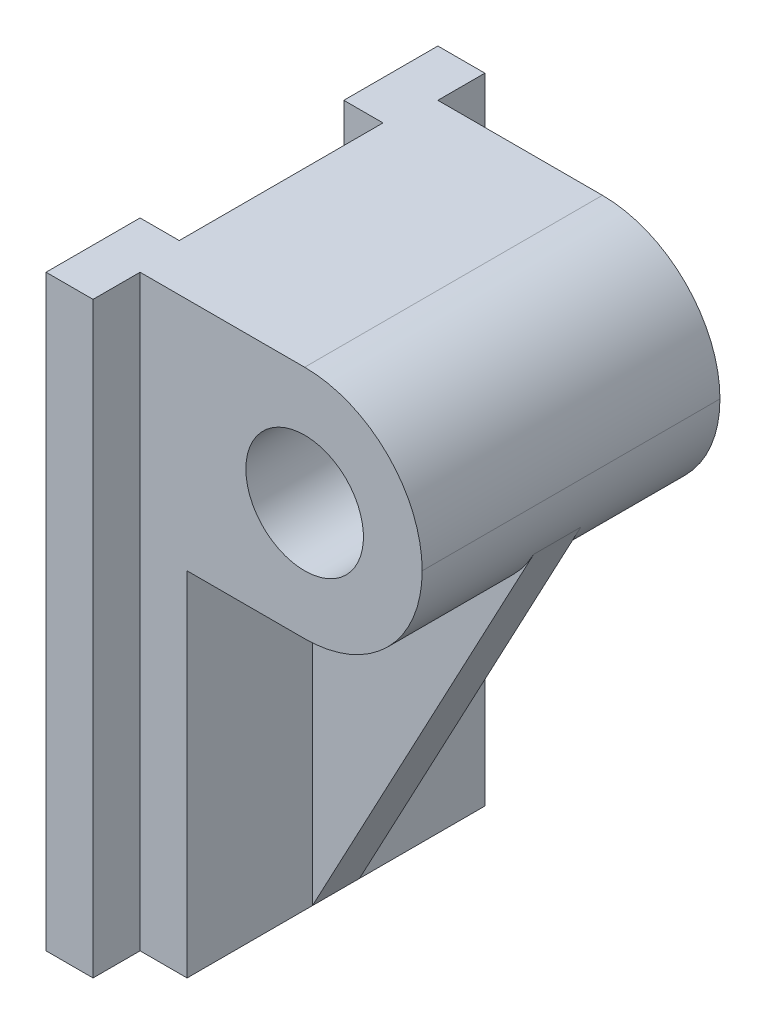
ISO-10303-21;
HEADER;
FILE_DESCRIPTION(('STEP AP214'),'2;1');
FILE_NAME('part.step','',(''),(''),'','','');
FILE_SCHEMA(('AUTOMOTIVE_DESIGN { 1 0 10303 214 1 1 1 1 }'));
ENDSEC;
DATA;
#1=APPLICATION_CONTEXT('core data for automotive mechanical design processes');
#2=APPLICATION_PROTOCOL_DEFINITION('international standard','automotive_design',2000,#1);
#3=PRODUCT_CONTEXT('',#1,'mechanical');
#4=PRODUCT('Part','Part','',(#3));
#5=PRODUCT_RELATED_PRODUCT_CATEGORY('part','',(#4));
#6=PRODUCT_DEFINITION_FORMATION('','',#4);
#7=PRODUCT_DEFINITION_CONTEXT('part definition',#1,'design');
#8=PRODUCT_DEFINITION('design','',#6,#7);
#9=PRODUCT_DEFINITION_SHAPE('','',#8);
#10=(LENGTH_UNIT() NAMED_UNIT(*) SI_UNIT(.MILLI.,.METRE.));
#11=(NAMED_UNIT(*) PLANE_ANGLE_UNIT() SI_UNIT($,.RADIAN.));
#12=(NAMED_UNIT(*) SI_UNIT($,.STERADIAN.) SOLID_ANGLE_UNIT());
#13=UNCERTAINTY_MEASURE_WITH_UNIT(LENGTH_MEASURE(1.E-05),#10,'distance_accuracy_value','');
#14=(GEOMETRIC_REPRESENTATION_CONTEXT(3) GLOBAL_UNCERTAINTY_ASSIGNED_CONTEXT((#13)) GLOBAL_UNIT_ASSIGNED_CONTEXT((#10,
#11,#12)) REPRESENTATION_CONTEXT('',''));
#15=CARTESIAN_POINT('',(0.,0.,0.));
#16=DIRECTION('',(0.,0.,1.));
#17=DIRECTION('',(1.,0.,0.));
#18=AXIS2_PLACEMENT_3D('',#15,#16,#17);
#19=CARTESIAN_POINT('',(24.,150.,38.));
#20=DIRECTION('',(-1.,0.,0.));
#21=DIRECTION('',(0.,0.,1.));
#22=AXIS2_PLACEMENT_3D('',#19,#20,#21);
#23=PLANE('',#22);
#24=DIRECTION('',(0.,1.,0.));
#25=VECTOR('',#24,1.);
#26=CARTESIAN_POINT('',(24.,150.,-6.));
#27=LINE('',#26,#25);
#28=CARTESIAN_POINT('',(24.,0.,-6.));
#29=VERTEX_POINT('',#28);
#30=CARTESIAN_POINT('',(23.9999999999999,90.,-6.));
#31=VERTEX_POINT('',#30);
#32=EDGE_CURVE('E181',#29,#31,#27,.T.);
#33=ORIENTED_EDGE('',*,*,#32,.F.);
#34=DIRECTION('',(0.,0.,-1.));
#35=VECTOR('',#34,1.);
#36=CARTESIAN_POINT('',(24.,0.,38.));
#37=LINE('',#36,#35);
#38=CARTESIAN_POINT('',(24.,0.,-38.));
#39=VERTEX_POINT('',#38);
#40=EDGE_CURVE('E187',#29,#39,#37,.T.);
#41=ORIENTED_EDGE('',*,*,#40,.T.);
#42=DIRECTION('',(0.,-1.,0.));
#43=VECTOR('',#42,1.);
#44=CARTESIAN_POINT('',(24.,150.,-38.));
#45=LINE('',#44,#43);
#46=CARTESIAN_POINT('',(24.,90.,-38.));
#47=VERTEX_POINT('',#46);
#48=EDGE_CURVE('E216',#47,#39,#45,.T.);
#49=ORIENTED_EDGE('',*,*,#48,.F.);
#50=DIRECTION('',(0.,0.,-1.));
#51=VECTOR('',#50,1.);
#52=CARTESIAN_POINT('',(23.9999999999999,90.,38.));
#53=LINE('',#52,#51);
#54=EDGE_CURVE('E189',#31,#47,#53,.T.);
#55=ORIENTED_EDGE('',*,*,#54,.F.);
#56=EDGE_LOOP('',(#33,#41,#49,#55));
#57=FACE_BOUND('',#56,.T.);
#58=ADVANCED_FACE('F33',(#57),#23,.F.);
#59=CARTESIAN_POINT('',(23.9999999999999,90.,38.));
#60=DIRECTION('',(0.,-1.,0.));
#61=DIRECTION('',(1.,0.,0.));
#62=AXIS2_PLACEMENT_3D('',#59,#60,#61);
#63=PLANE('',#62);
#64=DIRECTION('',(0.,0.,-1.));
#65=VECTOR('',#64,1.);
#66=CARTESIAN_POINT('',(53.9999999999999,90.,38.));
#67=LINE('',#66,#65);
#68=CARTESIAN_POINT('',(54.,90.,-38.));
#69=VERTEX_POINT('',#68);
#70=CARTESIAN_POINT('',(53.9999999999999,90.,-6.));
#71=VERTEX_POINT('',#70);
#72=EDGE_CURVE('E41',#69,#71,#67,.F.);
#73=ORIENTED_EDGE('',*,*,#72,.T.);
#74=DIRECTION('',(-1.,0.,0.));
#75=VECTOR('',#74,1.);
#76=CARTESIAN_POINT('',(23.9999999999999,90.,-6.));
#77=LINE('',#76,#75);
#78=EDGE_CURVE('E48',#71,#31,#77,.T.);
#79=ORIENTED_EDGE('',*,*,#78,.T.);
#80=ORIENTED_EDGE('',*,*,#54,.T.);
#81=DIRECTION('',(-1.,0.,0.));
#82=VECTOR('',#81,1.);
#83=CARTESIAN_POINT('',(24.,90.,-38.));
#84=LINE('',#83,#82);
#85=EDGE_CURVE('E266',#69,#47,#84,.T.);
#86=ORIENTED_EDGE('',*,*,#85,.F.);
#87=EDGE_LOOP('',(#73,#79,#80,#86));
#88=FACE_BOUND('',#87,.T.);
#89=ADVANCED_FACE('F379',(#88),#63,.T.);
#90=CARTESIAN_POINT('',(24.,0.,38.));
#91=VERTEX_POINT('',#90);
#92=CARTESIAN_POINT('',(24.,0.,6.));
#93=VERTEX_POINT('',#92);
#94=EDGE_CURVE('E197',#91,#93,#37,.T.);
#95=ORIENTED_EDGE('',*,*,#94,.T.);
#96=DIRECTION('',(0.,1.,0.));
#97=VECTOR('',#96,1.);
#98=CARTESIAN_POINT('',(24.,150.,6.));
#99=LINE('',#98,#97);
#100=CARTESIAN_POINT('',(23.9999999999999,90.,6.));
#101=VERTEX_POINT('',#100);
#102=EDGE_CURVE('E177',#93,#101,#99,.T.);
#103=ORIENTED_EDGE('',*,*,#102,.T.);
#104=CARTESIAN_POINT('',(24.,90.,38.));
#105=VERTEX_POINT('',#104);
#106=EDGE_CURVE('E273',#105,#101,#53,.T.);
#107=ORIENTED_EDGE('',*,*,#106,.F.);
#108=DIRECTION('',(0.,-1.,0.));
#109=VECTOR('',#108,1.);
#110=CARTESIAN_POINT('',(24.,150.,38.));
#111=LINE('',#110,#109);
#112=EDGE_CURVE('E218',#105,#91,#111,.T.);
#113=ORIENTED_EDGE('',*,*,#112,.T.);
#114=EDGE_LOOP('',(#95,#103,#107,#113));
#115=FACE_BOUND('',#114,.T.);
#116=ADVANCED_FACE('F326',(#115),#23,.F.);
#117=CARTESIAN_POINT('',(12.,150.,-50.));
#118=DIRECTION('',(0.,0.,1.));
#119=DIRECTION('',(1.,0.,0.));
#120=AXIS2_PLACEMENT_3D('',#117,#118,#119);
#121=PLANE('',#120);
#122=DIRECTION('',(-1.,0.,0.));
#123=VECTOR('',#122,1.);
#124=CARTESIAN_POINT('',(12.,0.,-50.));
#125=LINE('',#124,#123);
#126=CARTESIAN_POINT('',(12.,0.,-50.));
#127=VERTEX_POINT('',#126);
#128=CARTESIAN_POINT('',(0.,0.,-50.));
#129=VERTEX_POINT('',#128);
#130=EDGE_CURVE('E276',#127,#129,#125,.T.);
#131=ORIENTED_EDGE('',*,*,#130,.T.);
#132=DIRECTION('',(0.,-1.,0.));
#133=VECTOR('',#132,1.);
#134=CARTESIAN_POINT('',(0.,150.,-50.));
#135=LINE('',#134,#133);
#136=CARTESIAN_POINT('',(0.,150.,-50.));
#137=VERTEX_POINT('',#136);
#138=EDGE_CURVE('E241',#137,#129,#135,.T.);
#139=ORIENTED_EDGE('',*,*,#138,.F.);
#140=DIRECTION('',(-1.,0.,0.));
#141=VECTOR('',#140,1.);
#142=CARTESIAN_POINT('',(12.,150.,-50.));
#143=LINE('',#142,#141);
#144=CARTESIAN_POINT('',(12.,150.,-50.));
#145=VERTEX_POINT('',#144);
#146=EDGE_CURVE('E208',#145,#137,#143,.T.);
#147=ORIENTED_EDGE('',*,*,#146,.F.);
#148=DIRECTION('',(0.,-1.,0.));
#149=VECTOR('',#148,1.);
#150=CARTESIAN_POINT('',(12.,150.,-50.));
#151=LINE('',#150,#149);
#152=EDGE_CURVE('E209',#145,#127,#151,.T.);
#153=ORIENTED_EDGE('',*,*,#152,.T.);
#154=EDGE_LOOP('',(#131,#139,#147,#153));
#155=FACE_BOUND('',#154,.T.);
#156=ADVANCED_FACE('F367',(#155),#121,.F.);
#157=CARTESIAN_POINT('',(0.,150.,-50.));
#158=DIRECTION('',(1.,0.,0.));
#159=DIRECTION('',(0.,0.,-1.));
#160=AXIS2_PLACEMENT_3D('',#157,#158,#159);
#161=PLANE('',#160);
#162=DIRECTION('',(0.,0.,1.));
#163=VECTOR('',#162,1.);
#164=CARTESIAN_POINT('',(0.,0.,-50.));
#165=LINE('',#164,#163);
#166=CARTESIAN_POINT('',(0.,0.,-26.));
#167=VERTEX_POINT('',#166);
#168=EDGE_CURVE('E301',#129,#167,#165,.T.);
#169=ORIENTED_EDGE('',*,*,#168,.T.);
#170=DIRECTION('',(0.,-1.,0.));
#171=VECTOR('',#170,1.);
#172=CARTESIAN_POINT('',(0.,150.,-26.));
#173=LINE('',#172,#171);
#174=CARTESIAN_POINT('',(0.,150.,-26.));
#175=VERTEX_POINT('',#174);
#176=EDGE_CURVE('E238',#175,#167,#173,.T.);
#177=ORIENTED_EDGE('',*,*,#176,.F.);
#178=DIRECTION('',(0.,0.,1.));
#179=VECTOR('',#178,1.);
#180=CARTESIAN_POINT('',(0.,150.,-50.));
#181=LINE('',#180,#179);
#182=EDGE_CURVE('E279',#137,#175,#181,.T.);
#183=ORIENTED_EDGE('',*,*,#182,.F.);
#184=ORIENTED_EDGE('',*,*,#138,.T.);
#185=EDGE_LOOP('',(#169,#177,#183,#184));
#186=FACE_BOUND('',#185,.T.);
#187=ADVANCED_FACE('F363',(#186),#161,.F.);
#188=CARTESIAN_POINT('',(0.,150.,-26.));
#189=DIRECTION('',(0.,0.,-1.));
#190=DIRECTION('',(-1.,0.,0.));
#191=AXIS2_PLACEMENT_3D('',#188,#189,#190);
#192=PLANE('',#191);
#193=DIRECTION('',(1.,0.,0.));
#194=VECTOR('',#193,1.);
#195=CARTESIAN_POINT('',(0.,0.,-26.));
#196=LINE('',#195,#194);
#197=CARTESIAN_POINT('',(9.99999999999999,0.,-26.));
#198=VERTEX_POINT('',#197);
#199=EDGE_CURVE('E303',#167,#198,#196,.T.);
#200=ORIENTED_EDGE('',*,*,#199,.T.);
#201=DIRECTION('',(0.,-1.,0.));
#202=VECTOR('',#201,1.);
#203=CARTESIAN_POINT('',(9.99999999999999,150.,-26.));
#204=LINE('',#203,#202);
#205=CARTESIAN_POINT('',(9.99999999999999,150.,-26.));
#206=VERTEX_POINT('',#205);
#207=EDGE_CURVE('E235',#206,#198,#204,.T.);
#208=ORIENTED_EDGE('',*,*,#207,.F.);
#209=DIRECTION('',(1.,0.,0.));
#210=VECTOR('',#209,1.);
#211=CARTESIAN_POINT('',(0.,150.,-26.));
#212=LINE('',#211,#210);
#213=EDGE_CURVE('E281',#175,#206,#212,.T.);
#214=ORIENTED_EDGE('',*,*,#213,.F.);
#215=ORIENTED_EDGE('',*,*,#176,.T.);
#216=EDGE_LOOP('',(#200,#208,#214,#215));
#217=FACE_BOUND('',#216,.T.);
#218=ADVANCED_FACE('F359',(#217),#192,.F.);
#219=CARTESIAN_POINT('',(9.99999999999999,150.,-26.));
#220=DIRECTION('',(1.,0.,0.));
#221=DIRECTION('',(0.,0.,-1.));
#222=AXIS2_PLACEMENT_3D('',#219,#220,#221);
#223=PLANE('',#222);
#224=DIRECTION('',(0.,-1.,0.));
#225=VECTOR('',#224,1.);
#226=CARTESIAN_POINT('',(9.99999999999999,150.,26.));
#227=LINE('',#226,#225);
#228=CARTESIAN_POINT('',(9.99999999999999,150.,26.));
#229=VERTEX_POINT('',#228);
#230=CARTESIAN_POINT('',(9.99999999999999,0.,26.));
#231=VERTEX_POINT('',#230);
#232=EDGE_CURVE('E232',#229,#231,#227,.T.);
#233=ORIENTED_EDGE('',*,*,#232,.F.);
#234=DIRECTION('',(0.,0.,1.));
#235=VECTOR('',#234,1.);
#236=CARTESIAN_POINT('',(9.99999999999999,150.,-26.));
#237=LINE('',#236,#235);
#238=EDGE_CURVE('E283',#206,#229,#237,.T.);
#239=ORIENTED_EDGE('',*,*,#238,.F.);
#240=ORIENTED_EDGE('',*,*,#207,.T.);
#241=DIRECTION('',(0.,0.,1.));
#242=VECTOR('',#241,1.);
#243=CARTESIAN_POINT('',(9.99999999999999,0.,-26.));
#244=LINE('',#243,#242);
#245=EDGE_CURVE('E305',#198,#231,#244,.T.);
#246=ORIENTED_EDGE('',*,*,#245,.T.);
#247=EDGE_LOOP('',(#233,#239,#240,#246));
#248=FACE_BOUND('',#247,.T.);
#249=ADVANCED_FACE('F354',(#248),#223,.F.);
#250=CARTESIAN_POINT('',(9.99999999999999,150.,26.));
#251=DIRECTION('',(0.,0.,1.));
#252=DIRECTION('',(1.,0.,0.));
#253=AXIS2_PLACEMENT_3D('',#250,#251,#252);
#254=PLANE('',#253);
#255=DIRECTION('',(-1.,0.,0.));
#256=VECTOR('',#255,1.);
#257=CARTESIAN_POINT('',(9.99999999999999,0.,26.));
#258=LINE('',#257,#256);
#259=CARTESIAN_POINT('',(0.,0.,26.));
#260=VERTEX_POINT('',#259);
#261=EDGE_CURVE('E307',#231,#260,#258,.T.);
#262=ORIENTED_EDGE('',*,*,#261,.T.);
#263=DIRECTION('',(0.,-1.,0.));
#264=VECTOR('',#263,1.);
#265=CARTESIAN_POINT('',(0.,150.,26.));
#266=LINE('',#265,#264);
#267=CARTESIAN_POINT('',(0.,150.,26.));
#268=VERTEX_POINT('',#267);
#269=EDGE_CURVE('E229',#268,#260,#266,.T.);
#270=ORIENTED_EDGE('',*,*,#269,.F.);
#271=DIRECTION('',(-1.,0.,0.));
#272=VECTOR('',#271,1.);
#273=CARTESIAN_POINT('',(9.99999999999999,150.,26.));
#274=LINE('',#273,#272);
#275=EDGE_CURVE('E285',#229,#268,#274,.T.);
#276=ORIENTED_EDGE('',*,*,#275,.F.);
#277=ORIENTED_EDGE('',*,*,#232,.T.);
#278=EDGE_LOOP('',(#262,#270,#276,#277));
#279=FACE_BOUND('',#278,.T.);
#280=ADVANCED_FACE('F350',(#279),#254,.F.);
#281=CARTESIAN_POINT('',(0.,150.,26.));
#282=DIRECTION('',(1.,0.,0.));
#283=DIRECTION('',(0.,0.,-1.));
#284=AXIS2_PLACEMENT_3D('',#281,#282,#283);
#285=PLANE('',#284);
#286=DIRECTION('',(0.,0.,1.));
#287=VECTOR('',#286,1.);
#288=CARTESIAN_POINT('',(0.,0.,26.));
#289=LINE('',#288,#287);
#290=CARTESIAN_POINT('',(0.,0.,50.));
#291=VERTEX_POINT('',#290);
#292=EDGE_CURVE('E309',#260,#291,#289,.T.);
#293=ORIENTED_EDGE('',*,*,#292,.T.);
#294=DIRECTION('',(0.,-1.,0.));
#295=VECTOR('',#294,1.);
#296=CARTESIAN_POINT('',(0.,150.,50.));
#297=LINE('',#296,#295);
#298=CARTESIAN_POINT('',(0.,150.,50.));
#299=VERTEX_POINT('',#298);
#300=EDGE_CURVE('E226',#299,#291,#297,.T.);
#301=ORIENTED_EDGE('',*,*,#300,.F.);
#302=DIRECTION('',(0.,0.,1.));
#303=VECTOR('',#302,1.);
#304=CARTESIAN_POINT('',(0.,150.,26.));
#305=LINE('',#304,#303);
#306=EDGE_CURVE('E287',#268,#299,#305,.T.);
#307=ORIENTED_EDGE('',*,*,#306,.F.);
#308=ORIENTED_EDGE('',*,*,#269,.T.);
#309=EDGE_LOOP('',(#293,#301,#307,#308));
#310=FACE_BOUND('',#309,.T.);
#311=ADVANCED_FACE('F346',(#310),#285,.F.);
#312=CARTESIAN_POINT('',(0.,150.,50.));
#313=DIRECTION('',(0.,0.,-1.));
#314=DIRECTION('',(-1.,0.,0.));
#315=AXIS2_PLACEMENT_3D('',#312,#313,#314);
#316=PLANE('',#315);
#317=DIRECTION('',(1.,0.,0.));
#318=VECTOR('',#317,1.);
#319=CARTESIAN_POINT('',(0.,0.,50.));
#320=LINE('',#319,#318);
#321=CARTESIAN_POINT('',(12.,0.,50.));
#322=VERTEX_POINT('',#321);
#323=EDGE_CURVE('E311',#291,#322,#320,.T.);
#324=ORIENTED_EDGE('',*,*,#323,.T.);
#325=DIRECTION('',(0.,-1.,0.));
#326=VECTOR('',#325,1.);
#327=CARTESIAN_POINT('',(12.,150.,50.));
#328=LINE('',#327,#326);
#329=CARTESIAN_POINT('',(12.,150.,50.));
#330=VERTEX_POINT('',#329);
#331=EDGE_CURVE('E223',#330,#322,#328,.T.);
#332=ORIENTED_EDGE('',*,*,#331,.F.);
#333=DIRECTION('',(1.,0.,0.));
#334=VECTOR('',#333,1.);
#335=CARTESIAN_POINT('',(0.,150.,50.));
#336=LINE('',#335,#334);
#337=EDGE_CURVE('E289',#299,#330,#336,.T.);
#338=ORIENTED_EDGE('',*,*,#337,.F.);
#339=ORIENTED_EDGE('',*,*,#300,.T.);
#340=EDGE_LOOP('',(#324,#332,#338,#339));
#341=FACE_BOUND('',#340,.T.);
#342=ADVANCED_FACE('F342',(#341),#316,.F.);
#343=CARTESIAN_POINT('',(12.,150.,50.));
#344=DIRECTION('',(-1.,0.,0.));
#345=DIRECTION('',(0.,0.,1.));
#346=AXIS2_PLACEMENT_3D('',#343,#344,#345);
#347=PLANE('',#346);
#348=DIRECTION('',(0.,0.,-1.));
#349=VECTOR('',#348,1.);
#350=CARTESIAN_POINT('',(12.,0.,50.));
#351=LINE('',#350,#349);
#352=CARTESIAN_POINT('',(12.,0.,38.));
#353=VERTEX_POINT('',#352);
#354=EDGE_CURVE('E201',#322,#353,#351,.T.);
#355=ORIENTED_EDGE('',*,*,#354,.T.);
#356=DIRECTION('',(0.,-1.,0.));
#357=VECTOR('',#356,1.);
#358=CARTESIAN_POINT('',(12.,150.,38.));
#359=LINE('',#358,#357);
#360=CARTESIAN_POINT('',(12.,150.,38.));
#361=VERTEX_POINT('',#360);
#362=EDGE_CURVE('E220',#361,#353,#359,.T.);
#363=ORIENTED_EDGE('',*,*,#362,.F.);
#364=DIRECTION('',(0.,0.,-1.));
#365=VECTOR('',#364,1.);
#366=CARTESIAN_POINT('',(12.,150.,50.));
#367=LINE('',#366,#365);
#368=EDGE_CURVE('E291',#330,#361,#367,.T.);
#369=ORIENTED_EDGE('',*,*,#368,.F.);
#370=ORIENTED_EDGE('',*,*,#331,.T.);
#371=EDGE_LOOP('',(#355,#363,#369,#370));
#372=FACE_BOUND('',#371,.T.);
#373=ADVANCED_FACE('F315',(#372),#347,.F.);
#374=CARTESIAN_POINT('',(12.,150.,38.));
#375=DIRECTION('',(0.,0.,-1.));
#376=DIRECTION('',(-1.,0.,0.));
#377=AXIS2_PLACEMENT_3D('',#374,#375,#376);
#378=PLANE('',#377);
#379=CARTESIAN_POINT('',(53.9999999999999,120.,38.));
#380=DIRECTION('',(0.,0.,-1.));
#381=DIRECTION('',(-1.,0.,0.));
#382=AXIS2_PLACEMENT_3D('',#379,#380,#381);
#383=CIRCLE('',#382,30.);
#384=CARTESIAN_POINT('',(53.9999999999999,90.,38.));
#385=VERTEX_POINT('',#384);
#386=CARTESIAN_POINT('',(83.9999999999999,120.,38.));
#387=VERTEX_POINT('',#386);
#388=EDGE_CURVE('E56',#385,#387,#383,.F.);
#389=ORIENTED_EDGE('',*,*,#388,.T.);
#390=CARTESIAN_POINT('',(53.9999999999999,120.,38.));
#391=DIRECTION('',(0.,0.,-1.));
#392=DIRECTION('',(-1.,0.,0.));
#393=AXIS2_PLACEMENT_3D('',#390,#391,#392);
#394=CIRCLE('',#393,30.);
#395=CARTESIAN_POINT('',(53.9999999999999,150.,38.));
#396=VERTEX_POINT('',#395);
#397=EDGE_CURVE('E252',#387,#396,#394,.F.);
#398=ORIENTED_EDGE('',*,*,#397,.T.);
#399=DIRECTION('',(1.,0.,0.));
#400=VECTOR('',#399,1.);
#401=CARTESIAN_POINT('',(12.,150.,38.));
#402=LINE('',#401,#400);
#403=EDGE_CURVE('E293',#361,#396,#402,.T.);
#404=ORIENTED_EDGE('',*,*,#403,.F.);
#405=ORIENTED_EDGE('',*,*,#362,.T.);
#406=DIRECTION('',(1.,0.,0.));
#407=VECTOR('',#406,1.);
#408=CARTESIAN_POINT('',(12.,0.,38.));
#409=LINE('',#408,#407);
#410=EDGE_CURVE('E198',#353,#91,#409,.T.);
#411=ORIENTED_EDGE('',*,*,#410,.T.);
#412=ORIENTED_EDGE('',*,*,#112,.F.);
#413=DIRECTION('',(-1.,0.,0.));
#414=VECTOR('',#413,1.);
#415=CARTESIAN_POINT('',(23.9999999999999,90.,38.));
#416=LINE('',#415,#414);
#417=EDGE_CURVE('E269',#385,#105,#416,.T.);
#418=ORIENTED_EDGE('',*,*,#417,.F.);
#419=EDGE_LOOP('',(#389,#398,#404,#405,#411,#412,#418));
#420=FACE_BOUND('',#419,.T.);
#421=CARTESIAN_POINT('',(53.9999999999999,120.,38.));
#422=DIRECTION('',(0.,0.,-1.));
#423=DIRECTION('',(-1.,0.,0.));
#424=AXIS2_PLACEMENT_3D('',#421,#422,#423);
#425=CIRCLE('',#424,15.);
#426=CARTESIAN_POINT('',(38.9999999999999,120.,38.));
#427=VERTEX_POINT('',#426);
#428=EDGE_CURVE('E261',#427,#427,#425,.T.);
#429=ORIENTED_EDGE('',*,*,#428,.T.);
#430=EDGE_LOOP('',(#429));
#431=FACE_BOUND('',#430,.T.);
#432=ADVANCED_FACE('F321',(#420,#431),#378,.F.);
#433=CARTESIAN_POINT('',(24.,150.,-38.));
#434=DIRECTION('',(0.,0.,1.));
#435=DIRECTION('',(1.,0.,0.));
#436=AXIS2_PLACEMENT_3D('',#433,#434,#435);
#437=PLANE('',#436);
#438=DIRECTION('',(-1.,0.,0.));
#439=VECTOR('',#438,1.);
#440=CARTESIAN_POINT('',(24.,150.,-38.));
#441=LINE('',#440,#439);
#442=CARTESIAN_POINT('',(54.,150.,-38.));
#443=VERTEX_POINT('',#442);
#444=CARTESIAN_POINT('',(12.,150.,-38.));
#445=VERTEX_POINT('',#444);
#446=EDGE_CURVE('E296',#443,#445,#441,.T.);
#447=ORIENTED_EDGE('',*,*,#446,.F.);
#448=CARTESIAN_POINT('',(54.,120.,-38.));
#449=DIRECTION('',(0.,0.,1.));
#450=DIRECTION('',(1.,0.,0.));
#451=AXIS2_PLACEMENT_3D('',#448,#449,#450);
#452=CIRCLE('',#451,30.);
#453=CARTESIAN_POINT('',(83.9999999999999,120.,-38.));
#454=VERTEX_POINT('',#453);
#455=EDGE_CURVE('E248',#443,#454,#452,.F.);
#456=ORIENTED_EDGE('',*,*,#455,.T.);
#457=CARTESIAN_POINT('',(54.,120.,-38.));
#458=DIRECTION('',(0.,0.,1.));
#459=DIRECTION('',(1.,0.,0.));
#460=AXIS2_PLACEMENT_3D('',#457,#458,#459);
#461=CIRCLE('',#460,30.);
#462=EDGE_CURVE('E246',#454,#69,#461,.F.);
#463=ORIENTED_EDGE('',*,*,#462,.T.);
#464=ORIENTED_EDGE('',*,*,#85,.T.);
#465=ORIENTED_EDGE('',*,*,#48,.T.);
#466=DIRECTION('',(-1.,0.,0.));
#467=VECTOR('',#466,1.);
#468=CARTESIAN_POINT('',(24.,0.,-38.));
#469=LINE('',#468,#467);
#470=CARTESIAN_POINT('',(12.,0.,-38.));
#471=VERTEX_POINT('',#470);
#472=EDGE_CURVE('E196',#39,#471,#469,.T.);
#473=ORIENTED_EDGE('',*,*,#472,.T.);
#474=DIRECTION('',(0.,-1.,0.));
#475=VECTOR('',#474,1.);
#476=CARTESIAN_POINT('',(12.,150.,-38.));
#477=LINE('',#476,#475);
#478=EDGE_CURVE('E212',#445,#471,#477,.T.);
#479=ORIENTED_EDGE('',*,*,#478,.F.);
#480=EDGE_LOOP('',(#447,#456,#463,#464,#465,#473,#479));
#481=FACE_BOUND('',#480,.T.);
#482=CARTESIAN_POINT('',(54.,120.,-38.));
#483=DIRECTION('',(0.,0.,-1.));
#484=DIRECTION('',(-1.,0.,0.));
#485=AXIS2_PLACEMENT_3D('',#482,#483,#484);
#486=CIRCLE('',#485,15.);
#487=CARTESIAN_POINT('',(39.,120.,-38.));
#488=VERTEX_POINT('',#487);
#489=EDGE_CURVE('E256',#488,#488,#486,.T.);
#490=ORIENTED_EDGE('',*,*,#489,.F.);
#491=EDGE_LOOP('',(#490));
#492=FACE_BOUND('',#491,.T.);
#493=ADVANCED_FACE('F375',(#481,#492),#437,.F.);
#494=CARTESIAN_POINT('',(12.,150.,-38.));
#495=DIRECTION('',(-1.,0.,0.));
#496=DIRECTION('',(0.,0.,1.));
#497=AXIS2_PLACEMENT_3D('',#494,#495,#496);
#498=PLANE('',#497);
#499=DIRECTION('',(0.,0.,-1.));
#500=VECTOR('',#499,1.);
#501=CARTESIAN_POINT('',(12.,0.,-38.));
#502=LINE('',#501,#500);
#503=EDGE_CURVE('E206',#471,#127,#502,.T.);
#504=ORIENTED_EDGE('',*,*,#503,.T.);
#505=ORIENTED_EDGE('',*,*,#152,.F.);
#506=DIRECTION('',(0.,0.,-1.));
#507=VECTOR('',#506,1.);
#508=CARTESIAN_POINT('',(12.,150.,-38.));
#509=LINE('',#508,#507);
#510=EDGE_CURVE('E213',#445,#145,#509,.T.);
#511=ORIENTED_EDGE('',*,*,#510,.F.);
#512=ORIENTED_EDGE('',*,*,#478,.T.);
#513=EDGE_LOOP('',(#504,#505,#511,#512));
#514=FACE_BOUND('',#513,.T.);
#515=ADVANCED_FACE('F370',(#514),#498,.F.);
#516=CARTESIAN_POINT('',(0.,150.,0.));
#517=DIRECTION('',(0.,1.,0.));
#518=DIRECTION('',(0.,0.,1.));
#519=AXIS2_PLACEMENT_3D('',#516,#517,#518);
#520=PLANE('',#519);
#521=DIRECTION('',(0.,0.,-1.));
#522=VECTOR('',#521,1.);
#523=CARTESIAN_POINT('',(53.9999999999999,150.,0.));
#524=LINE('',#523,#522);
#525=EDGE_CURVE('E244',#396,#443,#524,.T.);
#526=ORIENTED_EDGE('',*,*,#525,.T.);
#527=ORIENTED_EDGE('',*,*,#446,.T.);
#528=ORIENTED_EDGE('',*,*,#510,.T.);
#529=ORIENTED_EDGE('',*,*,#146,.T.);
#530=ORIENTED_EDGE('',*,*,#182,.T.);
#531=ORIENTED_EDGE('',*,*,#213,.T.);
#532=ORIENTED_EDGE('',*,*,#238,.T.);
#533=ORIENTED_EDGE('',*,*,#275,.T.);
#534=ORIENTED_EDGE('',*,*,#306,.T.);
#535=ORIENTED_EDGE('',*,*,#337,.T.);
#536=ORIENTED_EDGE('',*,*,#368,.T.);
#537=ORIENTED_EDGE('',*,*,#403,.T.);
#538=EDGE_LOOP('',(#526,#527,#528,#529,#530,#531,#532,#533,#534,#535,#536,#537));
#539=FACE_BOUND('',#538,.T.);
#540=ADVANCED_FACE('F337',(#539),#520,.T.);
#541=CARTESIAN_POINT('',(0.,0.,0.));
#542=DIRECTION('',(0.,1.,0.));
#543=DIRECTION('',(0.,0.,1.));
#544=AXIS2_PLACEMENT_3D('',#541,#542,#543);
#545=PLANE('',#544);
#546=ORIENTED_EDGE('',*,*,#261,.F.);
#547=ORIENTED_EDGE('',*,*,#245,.F.);
#548=ORIENTED_EDGE('',*,*,#199,.F.);
#549=ORIENTED_EDGE('',*,*,#168,.F.);
#550=ORIENTED_EDGE('',*,*,#130,.F.);
#551=ORIENTED_EDGE('',*,*,#503,.F.);
#552=ORIENTED_EDGE('',*,*,#472,.F.);
#553=ORIENTED_EDGE('',*,*,#40,.F.);
#554=DIRECTION('',(0.,0.,-1.));
#555=VECTOR('',#554,1.);
#556=CARTESIAN_POINT('',(24.,0.,0.));
#557=LINE('',#556,#555);
#558=EDGE_CURVE('E165',#93,#29,#557,.T.);
#559=ORIENTED_EDGE('',*,*,#558,.F.);
#560=ORIENTED_EDGE('',*,*,#94,.F.);
#561=ORIENTED_EDGE('',*,*,#410,.F.);
#562=ORIENTED_EDGE('',*,*,#354,.F.);
#563=ORIENTED_EDGE('',*,*,#323,.F.);
#564=ORIENTED_EDGE('',*,*,#292,.F.);
#565=EDGE_LOOP('',(#546,#547,#548,#549,#550,#551,#552,#553,#559,#560,#561,#562,#563,#564));
#566=FACE_BOUND('',#565,.T.);
#567=ADVANCED_FACE('F194',(#566),#545,.F.);
#568=DIRECTION('',(-1.,0.,0.));
#569=VECTOR('',#568,1.);
#570=CARTESIAN_POINT('',(23.9999999999999,90.,6.));
#571=LINE('',#570,#569);
#572=CARTESIAN_POINT('',(53.9999999999999,90.,6.));
#573=VERTEX_POINT('',#572);
#574=EDGE_CURVE('E385',#573,#101,#571,.T.);
#575=ORIENTED_EDGE('',*,*,#574,.F.);
#576=EDGE_CURVE('E254',#573,#385,#67,.F.);
#577=ORIENTED_EDGE('',*,*,#576,.T.);
#578=ORIENTED_EDGE('',*,*,#417,.T.);
#579=ORIENTED_EDGE('',*,*,#106,.T.);
#580=EDGE_LOOP('',(#575,#577,#578,#579));
#581=FACE_BOUND('',#580,.T.);
#582=ADVANCED_FACE('F390',(#581),#63,.T.);
#583=CARTESIAN_POINT('',(53.9999999999999,120.,38.));
#584=DIRECTION('',(0.,0.,-1.));
#585=DIRECTION('',(-1.,0.,0.));
#586=AXIS2_PLACEMENT_3D('',#583,#584,#585);
#587=CYLINDRICAL_SURFACE('',#586,15.);
#588=ORIENTED_EDGE('',*,*,#428,.F.);
#589=EDGE_LOOP('',(#588));
#590=FACE_BOUND('',#589,.T.);
#591=ORIENTED_EDGE('',*,*,#489,.T.);
#592=EDGE_LOOP('',(#591));
#593=FACE_BOUND('',#592,.T.);
#594=ADVANCED_FACE('F392',(#590,#593),#587,.F.);
#595=CARTESIAN_POINT('',(53.9999999999999,120.,38.));
#596=DIRECTION('',(0.,0.,-1.));
#597=DIRECTION('',(-1.,0.,0.));
#598=AXIS2_PLACEMENT_3D('',#595,#596,#597);
#599=CYLINDRICAL_SURFACE('',#598,30.);
#600=CARTESIAN_POINT('',(53.9999999999999,120.,6.));
#601=DIRECTION('',(0.,0.,1.));
#602=DIRECTION('',(1.,0.,0.));
#603=AXIS2_PLACEMENT_3D('',#600,#601,#602);
#604=CIRCLE('',#603,30.);
#605=CARTESIAN_POINT('',(80.470588235294,105.882352941176,6.));
#606=VERTEX_POINT('',#605);
#607=EDGE_CURVE('E190',#606,#573,#604,.F.);
#608=ORIENTED_EDGE('',*,*,#607,.F.);
#609=DIRECTION('',(0.,0.,-1.));
#610=VECTOR('',#609,1.);
#611=CARTESIAN_POINT('',(80.470588235294,105.882352941176,38.));
#612=LINE('',#611,#610);
#613=CARTESIAN_POINT('',(80.470588235294,105.882352941176,-6.));
#614=VERTEX_POINT('',#613);
#615=EDGE_CURVE('E11',#614,#606,#612,.F.);
#616=ORIENTED_EDGE('',*,*,#615,.F.);
#617=CARTESIAN_POINT('',(53.9999999999999,120.,-6.));
#618=DIRECTION('',(0.,0.,1.));
#619=DIRECTION('',(1.,0.,0.));
#620=AXIS2_PLACEMENT_3D('',#617,#618,#619);
#621=CIRCLE('',#620,30.);
#622=EDGE_CURVE('E182',#614,#71,#621,.F.);
#623=ORIENTED_EDGE('',*,*,#622,.T.);
#624=ORIENTED_EDGE('',*,*,#72,.F.);
#625=ORIENTED_EDGE('',*,*,#462,.F.);
#626=DIRECTION('',(0.,0.,-1.));
#627=VECTOR('',#626,1.);
#628=CARTESIAN_POINT('',(83.9999999999999,120.,38.));
#629=LINE('',#628,#627);
#630=EDGE_CURVE('E176',#387,#454,#629,.T.);
#631=ORIENTED_EDGE('',*,*,#630,.F.);
#632=ORIENTED_EDGE('',*,*,#388,.F.);
#633=ORIENTED_EDGE('',*,*,#576,.F.);
#634=EDGE_LOOP('',(#608,#616,#623,#624,#625,#631,#632,#633));
#635=FACE_BOUND('',#634,.T.);
#636=ADVANCED_FACE('F35',(#635),#599,.T.);
#637=CARTESIAN_POINT('',(53.9999999999999,120.,0.));
#638=DIRECTION('',(0.,0.,-1.));
#639=DIRECTION('',(-1.,0.,0.));
#640=AXIS2_PLACEMENT_3D('',#637,#638,#639);
#641=CYLINDRICAL_SURFACE('',#640,30.);
#642=ORIENTED_EDGE('',*,*,#630,.T.);
#643=ORIENTED_EDGE('',*,*,#455,.F.);
#644=ORIENTED_EDGE('',*,*,#525,.F.);
#645=ORIENTED_EDGE('',*,*,#397,.F.);
#646=EDGE_LOOP('',(#642,#643,#644,#645));
#647=FACE_BOUND('',#646,.T.);
#648=ADVANCED_FACE('F335',(#647),#641,.T.);
#649=CARTESIAN_POINT('',(42.,75.,6.));
#650=DIRECTION('',(0.,0.,1.));
#651=DIRECTION('',(1.,0.,0.));
#652=AXIS2_PLACEMENT_3D('',#649,#650,#651);
#653=PLANE('',#652);
#654=ORIENTED_EDGE('',*,*,#102,.F.);
#655=DIRECTION('',(0.470588235294117,0.882352941176471,0.));
#656=VECTOR('',#655,1.);
#657=CARTESIAN_POINT('',(24.,0.,6.));
#658=LINE('',#657,#656);
#659=EDGE_CURVE('E171',#93,#606,#658,.T.);
#660=ORIENTED_EDGE('',*,*,#659,.T.);
#661=ORIENTED_EDGE('',*,*,#607,.T.);
#662=ORIENTED_EDGE('',*,*,#574,.T.);
#663=EDGE_LOOP('',(#654,#660,#661,#662));
#664=FACE_BOUND('',#663,.T.);
#665=ADVANCED_FACE('F389',(#664),#653,.T.);
#666=CARTESIAN_POINT('',(42.,75.,-6.));
#667=DIRECTION('',(0.,0.,1.));
#668=DIRECTION('',(1.,0.,0.));
#669=AXIS2_PLACEMENT_3D('',#666,#667,#668);
#670=PLANE('',#669);
#671=DIRECTION('',(0.470588235294117,0.882352941176471,0.));
#672=VECTOR('',#671,1.);
#673=CARTESIAN_POINT('',(24.,0.,-6.));
#674=LINE('',#673,#672);
#675=EDGE_CURVE('E168',#29,#614,#674,.T.);
#676=ORIENTED_EDGE('',*,*,#675,.F.);
#677=ORIENTED_EDGE('',*,*,#32,.T.);
#678=ORIENTED_EDGE('',*,*,#78,.F.);
#679=ORIENTED_EDGE('',*,*,#622,.F.);
#680=EDGE_LOOP('',(#676,#677,#678,#679));
#681=FACE_BOUND('',#680,.T.);
#682=ADVANCED_FACE('F180',(#681),#670,.F.);
#683=CARTESIAN_POINT('',(24.,0.,0.));
#684=DIRECTION('',(0.882352941176471,-0.470588235294117,0.));
#685=DIRECTION('',(0.470588235294117,0.882352941176471,0.));
#686=AXIS2_PLACEMENT_3D('',#683,#684,#685);
#687=PLANE('',#686);
#688=ORIENTED_EDGE('',*,*,#659,.F.);
#689=ORIENTED_EDGE('',*,*,#558,.T.);
#690=ORIENTED_EDGE('',*,*,#675,.T.);
#691=ORIENTED_EDGE('',*,*,#615,.T.);
#692=EDGE_LOOP('',(#688,#689,#690,#691));
#693=FACE_BOUND('',#692,.T.);
#694=ADVANCED_FACE('F167',(#693),#687,.T.);
#695=CLOSED_SHELL('',(#58,#89,#116,#156,#187,#218,#249,#280,#311,#342,#373,#432,#493,#515,#540,
#567,#582,#594,#636,#648,#665,#682,#694));
#696=MANIFOLD_SOLID_BREP('B2',#695);
#697=ADVANCED_BREP_SHAPE_REPRESENTATION('',(#18,#696),#14);
#698=SHAPE_DEFINITION_REPRESENTATION(#9,#697);
ENDSEC;
END-ISO-10303-21;
